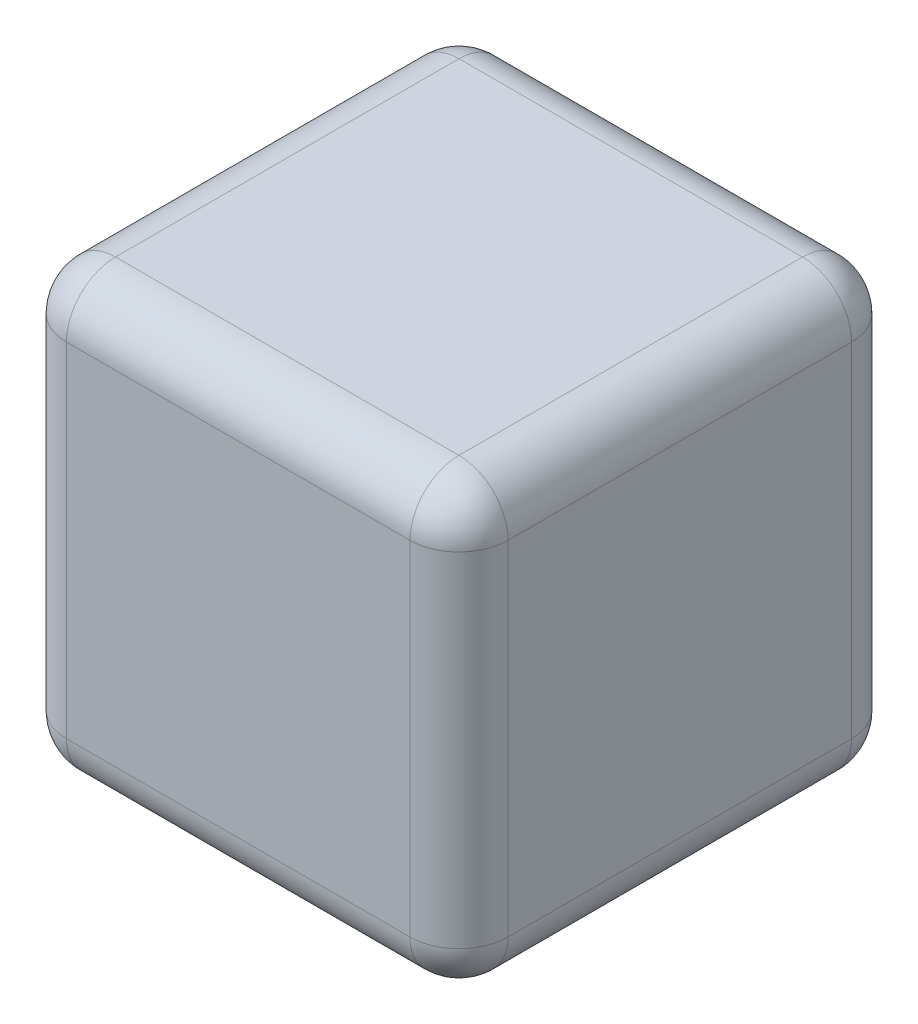
ISO-10303-21;
HEADER;
FILE_DESCRIPTION(('STEP AP214'),'2;1');
FILE_NAME('part.step','',(''),(''),'','','');
FILE_SCHEMA(('AUTOMOTIVE_DESIGN { 1 0 10303 214 1 1 1 1 }'));
ENDSEC;
DATA;
#1=APPLICATION_CONTEXT('core data for automotive mechanical design processes');
#2=APPLICATION_PROTOCOL_DEFINITION('international standard','automotive_design',2000,#1);
#3=PRODUCT_CONTEXT('',#1,'mechanical');
#4=PRODUCT('Part','Part','',(#3));
#5=PRODUCT_RELATED_PRODUCT_CATEGORY('part','',(#4));
#6=PRODUCT_DEFINITION_FORMATION('','',#4);
#7=PRODUCT_DEFINITION_CONTEXT('part definition',#1,'design');
#8=PRODUCT_DEFINITION('design','',#6,#7);
#9=PRODUCT_DEFINITION_SHAPE('','',#8);
#10=(LENGTH_UNIT() NAMED_UNIT(*) SI_UNIT(.MILLI.,.METRE.));
#11=(NAMED_UNIT(*) PLANE_ANGLE_UNIT() SI_UNIT($,.RADIAN.));
#12=(NAMED_UNIT(*) SI_UNIT($,.STERADIAN.) SOLID_ANGLE_UNIT());
#13=UNCERTAINTY_MEASURE_WITH_UNIT(LENGTH_MEASURE(1.E-05),#10,'distance_accuracy_value','');
#14=(GEOMETRIC_REPRESENTATION_CONTEXT(3) GLOBAL_UNCERTAINTY_ASSIGNED_CONTEXT((#13)) GLOBAL_UNIT_ASSIGNED_CONTEXT((#10,
#11,#12)) REPRESENTATION_CONTEXT('',''));
#15=CARTESIAN_POINT('',(0.,0.,0.));
#16=DIRECTION('',(0.,0.,1.));
#17=DIRECTION('',(1.,0.,0.));
#18=AXIS2_PLACEMENT_3D('',#15,#16,#17);
#19=CARTESIAN_POINT('',(4.5,4.5,-4.5));
#20=DIRECTION('',(0.,0.,1.));
#21=DIRECTION('',(0.,-1.,0.));
#22=AXIS2_PLACEMENT_3D('',#19,#20,#21);
#23=PLANE('',#22);
#24=DIRECTION('',(0.,1.,0.));
#25=VECTOR('',#24,1.);
#26=CARTESIAN_POINT('',(3.5,-4.5,-4.5));
#27=LINE('',#26,#25);
#28=CARTESIAN_POINT('',(3.5,3.5,-4.5));
#29=VERTEX_POINT('',#28);
#30=CARTESIAN_POINT('',(3.5,-3.5,-4.5));
#31=VERTEX_POINT('',#30);
#32=EDGE_CURVE('E176',#29,#31,#27,.F.);
#33=ORIENTED_EDGE('',*,*,#32,.T.);
#34=DIRECTION('',(-1.,0.,0.));
#35=VECTOR('',#34,1.);
#36=CARTESIAN_POINT('',(4.5,-3.5,-4.5));
#37=LINE('',#36,#35);
#38=CARTESIAN_POINT('',(-3.5,-3.5,-4.5));
#39=VERTEX_POINT('',#38);
#40=EDGE_CURVE('E181',#31,#39,#37,.T.);
#41=ORIENTED_EDGE('',*,*,#40,.T.);
#42=DIRECTION('',(0.,1.,0.));
#43=VECTOR('',#42,1.);
#44=CARTESIAN_POINT('',(-3.5,4.5,-4.5));
#45=LINE('',#44,#43);
#46=CARTESIAN_POINT('',(-3.5,3.5,-4.5));
#47=VERTEX_POINT('',#46);
#48=EDGE_CURVE('E178',#39,#47,#45,.T.);
#49=ORIENTED_EDGE('',*,*,#48,.T.);
#50=DIRECTION('',(-1.,0.,0.));
#51=VECTOR('',#50,1.);
#52=CARTESIAN_POINT('',(4.5,3.5,-4.5));
#53=LINE('',#52,#51);
#54=EDGE_CURVE('E174',#47,#29,#53,.F.);
#55=ORIENTED_EDGE('',*,*,#54,.T.);
#56=EDGE_LOOP('',(#33,#41,#49,#55));
#57=FACE_BOUND('',#56,.T.);
#58=ADVANCED_FACE('F33',(#57),#23,.F.);
#59=CARTESIAN_POINT('',(4.5,4.5,4.5));
#60=DIRECTION('',(0.,-1.,0.));
#61=DIRECTION('',(0.,0.,-1.));
#62=AXIS2_PLACEMENT_3D('',#59,#60,#61);
#63=PLANE('',#62);
#64=DIRECTION('',(-1.,0.,0.));
#65=VECTOR('',#64,1.);
#66=CARTESIAN_POINT('',(4.5,4.5,-3.5));
#67=LINE('',#66,#65);
#68=CARTESIAN_POINT('',(3.5,4.5,-3.5));
#69=VERTEX_POINT('',#68);
#70=CARTESIAN_POINT('',(-3.5,4.5,-3.5));
#71=VERTEX_POINT('',#70);
#72=EDGE_CURVE('E42',#69,#71,#67,.T.);
#73=ORIENTED_EDGE('',*,*,#72,.T.);
#74=DIRECTION('',(0.,0.,1.));
#75=VECTOR('',#74,1.);
#76=CARTESIAN_POINT('',(-3.5,4.5,4.5));
#77=LINE('',#76,#75);
#78=CARTESIAN_POINT('',(-3.5,4.5,3.5));
#79=VERTEX_POINT('',#78);
#80=EDGE_CURVE('E11',#71,#79,#77,.T.);
#81=ORIENTED_EDGE('',*,*,#80,.T.);
#82=DIRECTION('',(-1.,0.,0.));
#83=VECTOR('',#82,1.);
#84=CARTESIAN_POINT('',(4.5,4.5,3.5));
#85=LINE('',#84,#83);
#86=CARTESIAN_POINT('',(3.5,4.5,3.5));
#87=VERTEX_POINT('',#86);
#88=EDGE_CURVE('E199',#79,#87,#85,.F.);
#89=ORIENTED_EDGE('',*,*,#88,.T.);
#90=DIRECTION('',(0.,0.,1.));
#91=VECTOR('',#90,1.);
#92=CARTESIAN_POINT('',(3.5,4.5,-4.5));
#93=LINE('',#92,#91);
#94=EDGE_CURVE('E53',#87,#69,#93,.F.);
#95=ORIENTED_EDGE('',*,*,#94,.T.);
#96=EDGE_LOOP('',(#73,#81,#89,#95));
#97=FACE_BOUND('',#96,.T.);
#98=ADVANCED_FACE('F306',(#97),#63,.F.);
#99=CARTESIAN_POINT('',(4.5,4.5,4.5));
#100=DIRECTION('',(0.,0.,-1.));
#101=DIRECTION('',(-1.,0.,0.));
#102=AXIS2_PLACEMENT_3D('',#99,#100,#101);
#103=PLANE('',#102);
#104=DIRECTION('',(0.,-1.,0.));
#105=VECTOR('',#104,1.);
#106=CARTESIAN_POINT('',(-3.5,4.5,4.5));
#107=LINE('',#106,#105);
#108=CARTESIAN_POINT('',(-3.5,3.5,4.5));
#109=VERTEX_POINT('',#108);
#110=CARTESIAN_POINT('',(-3.5,-3.5,4.5));
#111=VERTEX_POINT('',#110);
#112=EDGE_CURVE('E133',#109,#111,#107,.T.);
#113=ORIENTED_EDGE('',*,*,#112,.T.);
#114=DIRECTION('',(-1.,0.,0.));
#115=VECTOR('',#114,1.);
#116=CARTESIAN_POINT('',(4.5,-3.5,4.5));
#117=LINE('',#116,#115);
#118=CARTESIAN_POINT('',(3.5,-3.5,4.5));
#119=VERTEX_POINT('',#118);
#120=EDGE_CURVE('E129',#111,#119,#117,.F.);
#121=ORIENTED_EDGE('',*,*,#120,.T.);
#122=DIRECTION('',(0.,-1.,0.));
#123=VECTOR('',#122,1.);
#124=CARTESIAN_POINT('',(3.5,4.5,4.5));
#125=LINE('',#124,#123);
#126=CARTESIAN_POINT('',(3.5,3.5,4.5));
#127=VERTEX_POINT('',#126);
#128=EDGE_CURVE('E121',#119,#127,#125,.F.);
#129=ORIENTED_EDGE('',*,*,#128,.T.);
#130=DIRECTION('',(-1.,0.,0.));
#131=VECTOR('',#130,1.);
#132=CARTESIAN_POINT('',(4.5,3.5,4.5));
#133=LINE('',#132,#131);
#134=EDGE_CURVE('E126',#127,#109,#133,.T.);
#135=ORIENTED_EDGE('',*,*,#134,.T.);
#136=EDGE_LOOP('',(#113,#121,#129,#135));
#137=FACE_BOUND('',#136,.T.);
#138=ADVANCED_FACE('F124',(#137),#103,.F.);
#139=CARTESIAN_POINT('',(4.5,-4.5,4.5));
#140=DIRECTION('',(0.,1.,0.));
#141=DIRECTION('',(0.,0.,1.));
#142=AXIS2_PLACEMENT_3D('',#139,#140,#141);
#143=PLANE('',#142);
#144=DIRECTION('',(0.,0.,-1.));
#145=VECTOR('',#144,1.);
#146=CARTESIAN_POINT('',(3.5,-4.5,4.5));
#147=LINE('',#146,#145);
#148=CARTESIAN_POINT('',(3.5,-4.5,-3.5));
#149=VERTEX_POINT('',#148);
#150=CARTESIAN_POINT('',(3.5,-4.5,3.5));
#151=VERTEX_POINT('',#150);
#152=EDGE_CURVE('E190',#149,#151,#147,.F.);
#153=ORIENTED_EDGE('',*,*,#152,.T.);
#154=DIRECTION('',(-1.,0.,0.));
#155=VECTOR('',#154,1.);
#156=CARTESIAN_POINT('',(4.5,-4.5,3.5));
#157=LINE('',#156,#155);
#158=CARTESIAN_POINT('',(-3.5,-4.5,3.5));
#159=VERTEX_POINT('',#158);
#160=EDGE_CURVE('E196',#151,#159,#157,.T.);
#161=ORIENTED_EDGE('',*,*,#160,.T.);
#162=DIRECTION('',(0.,0.,-1.));
#163=VECTOR('',#162,1.);
#164=CARTESIAN_POINT('',(-3.5,-4.5,4.5));
#165=LINE('',#164,#163);
#166=CARTESIAN_POINT('',(-3.5,-4.5,-3.5));
#167=VERTEX_POINT('',#166);
#168=EDGE_CURVE('E194',#159,#167,#165,.T.);
#169=ORIENTED_EDGE('',*,*,#168,.T.);
#170=DIRECTION('',(-1.,0.,0.));
#171=VECTOR('',#170,1.);
#172=CARTESIAN_POINT('',(4.5,-4.5,-3.5));
#173=LINE('',#172,#171);
#174=EDGE_CURVE('E192',#167,#149,#173,.F.);
#175=ORIENTED_EDGE('',*,*,#174,.T.);
#176=EDGE_LOOP('',(#153,#161,#169,#175));
#177=FACE_BOUND('',#176,.T.);
#178=ADVANCED_FACE('F265',(#177),#143,.F.);
#179=CARTESIAN_POINT('',(4.5,0.,0.));
#180=DIRECTION('',(1.,0.,0.));
#181=DIRECTION('',(0.,0.,-1.));
#182=AXIS2_PLACEMENT_3D('',#179,#180,#181);
#183=PLANE('',#182);
#184=DIRECTION('',(0.,-1.,0.));
#185=VECTOR('',#184,1.);
#186=CARTESIAN_POINT('',(4.5,-4.5,3.5));
#187=LINE('',#186,#185);
#188=CARTESIAN_POINT('',(4.5,3.5,3.5));
#189=VERTEX_POINT('',#188);
#190=CARTESIAN_POINT('',(4.5,-3.5,3.5));
#191=VERTEX_POINT('',#190);
#192=EDGE_CURVE('E141',#189,#191,#187,.T.);
#193=ORIENTED_EDGE('',*,*,#192,.T.);
#194=DIRECTION('',(0.,0.,-1.));
#195=VECTOR('',#194,1.);
#196=CARTESIAN_POINT('',(4.5,-3.5,-4.5));
#197=LINE('',#196,#195);
#198=CARTESIAN_POINT('',(4.5,-3.5,-3.5));
#199=VERTEX_POINT('',#198);
#200=EDGE_CURVE('E188',#191,#199,#197,.T.);
#201=ORIENTED_EDGE('',*,*,#200,.T.);
#202=DIRECTION('',(0.,1.,0.));
#203=VECTOR('',#202,1.);
#204=CARTESIAN_POINT('',(4.5,4.5,-3.5));
#205=LINE('',#204,#203);
#206=CARTESIAN_POINT('',(4.5,3.5,-3.5));
#207=VERTEX_POINT('',#206);
#208=EDGE_CURVE('E185',#199,#207,#205,.T.);
#209=ORIENTED_EDGE('',*,*,#208,.T.);
#210=DIRECTION('',(0.,0.,1.));
#211=VECTOR('',#210,1.);
#212=CARTESIAN_POINT('',(4.5,3.5,4.5));
#213=LINE('',#212,#211);
#214=EDGE_CURVE('E183',#207,#189,#213,.T.);
#215=ORIENTED_EDGE('',*,*,#214,.T.);
#216=EDGE_LOOP('',(#193,#201,#209,#215));
#217=FACE_BOUND('',#216,.T.);
#218=ADVANCED_FACE('F294',(#217),#183,.T.);
#219=CARTESIAN_POINT('',(-4.5,0.,0.));
#220=DIRECTION('',(1.,0.,0.));
#221=DIRECTION('',(0.,0.,-1.));
#222=AXIS2_PLACEMENT_3D('',#219,#220,#221);
#223=PLANE('',#222);
#224=DIRECTION('',(0.,1.,0.));
#225=VECTOR('',#224,1.);
#226=CARTESIAN_POINT('',(-4.5,0.,-3.5));
#227=LINE('',#226,#225);
#228=CARTESIAN_POINT('',(-4.5,3.5,-3.5));
#229=VERTEX_POINT('',#228);
#230=CARTESIAN_POINT('',(-4.5,-3.5,-3.5));
#231=VERTEX_POINT('',#230);
#232=EDGE_CURVE('E167',#229,#231,#227,.F.);
#233=ORIENTED_EDGE('',*,*,#232,.T.);
#234=DIRECTION('',(0.,0.,-1.));
#235=VECTOR('',#234,1.);
#236=CARTESIAN_POINT('',(-4.5,-3.5,0.));
#237=LINE('',#236,#235);
#238=CARTESIAN_POINT('',(-4.5,-3.5,3.5));
#239=VERTEX_POINT('',#238);
#240=EDGE_CURVE('E172',#231,#239,#237,.F.);
#241=ORIENTED_EDGE('',*,*,#240,.T.);
#242=DIRECTION('',(0.,-1.,0.));
#243=VECTOR('',#242,1.);
#244=CARTESIAN_POINT('',(-4.5,0.,3.5));
#245=LINE('',#244,#243);
#246=CARTESIAN_POINT('',(-4.5,3.5,3.5));
#247=VERTEX_POINT('',#246);
#248=EDGE_CURVE('E169',#239,#247,#245,.F.);
#249=ORIENTED_EDGE('',*,*,#248,.T.);
#250=DIRECTION('',(0.,0.,1.));
#251=VECTOR('',#250,1.);
#252=CARTESIAN_POINT('',(-4.5,3.5,0.));
#253=LINE('',#252,#251);
#254=EDGE_CURVE('E165',#247,#229,#253,.F.);
#255=ORIENTED_EDGE('',*,*,#254,.T.);
#256=EDGE_LOOP('',(#233,#241,#249,#255));
#257=FACE_BOUND('',#256,.T.);
#258=ADVANCED_FACE('F296',(#257),#223,.F.);
#259=CARTESIAN_POINT('',(3.5,0.,-3.5));
#260=DIRECTION('',(0.,-1.,0.));
#261=DIRECTION('',(0.,0.,-1.));
#262=AXIS2_PLACEMENT_3D('',#259,#260,#261);
#263=CYLINDRICAL_SURFACE('',#262,1.);
#264=CARTESIAN_POINT('',(3.5,3.5,-3.5));
#265=DIRECTION('',(0.,1.,0.));
#266=DIRECTION('',(0.,0.,1.));
#267=AXIS2_PLACEMENT_3D('',#264,#265,#266);
#268=CIRCLE('',#267,1.);
#269=EDGE_CURVE('E37',#207,#29,#268,.T.);
#270=ORIENTED_EDGE('',*,*,#269,.F.);
#271=ORIENTED_EDGE('',*,*,#208,.F.);
#272=CARTESIAN_POINT('',(3.5,-3.5,-3.5));
#273=DIRECTION('',(0.,-1.,0.));
#274=DIRECTION('',(1.,0.,0.));
#275=AXIS2_PLACEMENT_3D('',#272,#273,#274);
#276=CIRCLE('',#275,1.);
#277=EDGE_CURVE('E161',#31,#199,#276,.T.);
#278=ORIENTED_EDGE('',*,*,#277,.F.);
#279=ORIENTED_EDGE('',*,*,#32,.F.);
#280=EDGE_LOOP('',(#270,#271,#278,#279));
#281=FACE_BOUND('',#280,.T.);
#282=ADVANCED_FACE('F35',(#281),#263,.T.);
#283=CARTESIAN_POINT('',(3.5,3.5,-3.5));
#284=DIRECTION('',(0.,0.,-1.));
#285=DIRECTION('',(-1.,0.,0.));
#286=AXIS2_PLACEMENT_3D('',#283,#284,#285);
#287=SPHERICAL_SURFACE('',#286,1.);
#288=CARTESIAN_POINT('',(3.5,3.5,-3.5));
#289=DIRECTION('',(0.,0.,-1.));
#290=DIRECTION('',(-1.,0.,0.));
#291=AXIS2_PLACEMENT_3D('',#288,#289,#290);
#292=CIRCLE('',#291,1.);
#293=EDGE_CURVE('E244',#207,#69,#292,.F.);
#294=ORIENTED_EDGE('',*,*,#293,.F.);
#295=ORIENTED_EDGE('',*,*,#269,.T.);
#296=CARTESIAN_POINT('',(3.5,3.5,-3.5));
#297=DIRECTION('',(1.,0.,0.));
#298=DIRECTION('',(0.,0.,-1.));
#299=AXIS2_PLACEMENT_3D('',#296,#297,#298);
#300=CIRCLE('',#299,1.);
#301=EDGE_CURVE('E246',#69,#29,#300,.F.);
#302=ORIENTED_EDGE('',*,*,#301,.F.);
#303=EDGE_LOOP('',(#294,#295,#302));
#304=FACE_BOUND('',#303,.T.);
#305=ADVANCED_FACE('F289',(#304),#287,.T.);
#306=CARTESIAN_POINT('',(3.5,-3.5,-3.5));
#307=DIRECTION('',(1.,0.,0.));
#308=DIRECTION('',(0.,0.,-1.));
#309=AXIS2_PLACEMENT_3D('',#306,#307,#308);
#310=SPHERICAL_SURFACE('',#309,1.);
#311=CARTESIAN_POINT('',(3.5,-3.5,-3.5));
#312=DIRECTION('',(1.,0.,0.));
#313=DIRECTION('',(0.,0.,-1.));
#314=AXIS2_PLACEMENT_3D('',#311,#312,#313);
#315=CIRCLE('',#314,1.);
#316=EDGE_CURVE('E238',#31,#149,#315,.F.);
#317=ORIENTED_EDGE('',*,*,#316,.F.);
#318=ORIENTED_EDGE('',*,*,#277,.T.);
#319=CARTESIAN_POINT('',(3.5,-3.5,-3.5));
#320=DIRECTION('',(0.,0.,-1.));
#321=DIRECTION('',(-1.,0.,0.));
#322=AXIS2_PLACEMENT_3D('',#319,#320,#321);
#323=CIRCLE('',#322,1.);
#324=EDGE_CURVE('E241',#149,#199,#323,.F.);
#325=ORIENTED_EDGE('',*,*,#324,.F.);
#326=EDGE_LOOP('',(#317,#318,#325));
#327=FACE_BOUND('',#326,.T.);
#328=ADVANCED_FACE('F253',(#327),#310,.T.);
#329=CARTESIAN_POINT('',(4.5,3.5,-3.5));
#330=DIRECTION('',(-1.,0.,0.));
#331=DIRECTION('',(0.,0.,1.));
#332=AXIS2_PLACEMENT_3D('',#329,#330,#331);
#333=CYLINDRICAL_SURFACE('',#332,1.);
#334=ORIENTED_EDGE('',*,*,#301,.T.);
#335=ORIENTED_EDGE('',*,*,#54,.F.);
#336=CARTESIAN_POINT('',(-3.5,3.5,-3.5));
#337=DIRECTION('',(-1.,0.,0.));
#338=DIRECTION('',(0.,0.,1.));
#339=AXIS2_PLACEMENT_3D('',#336,#337,#338);
#340=CIRCLE('',#339,1.);
#341=EDGE_CURVE('E233',#71,#47,#340,.T.);
#342=ORIENTED_EDGE('',*,*,#341,.F.);
#343=ORIENTED_EDGE('',*,*,#72,.F.);
#344=EDGE_LOOP('',(#334,#335,#342,#343));
#345=FACE_BOUND('',#344,.T.);
#346=ADVANCED_FACE('F284',(#345),#333,.T.);
#347=CARTESIAN_POINT('',(3.5,3.5,0.));
#348=DIRECTION('',(0.,0.,-1.));
#349=DIRECTION('',(-1.,0.,0.));
#350=AXIS2_PLACEMENT_3D('',#347,#348,#349);
#351=CYLINDRICAL_SURFACE('',#350,1.);
#352=ORIENTED_EDGE('',*,*,#293,.T.);
#353=ORIENTED_EDGE('',*,*,#94,.F.);
#354=CARTESIAN_POINT('',(3.5,3.5,3.5));
#355=DIRECTION('',(0.,0.,1.));
#356=DIRECTION('',(1.,0.,0.));
#357=AXIS2_PLACEMENT_3D('',#354,#355,#356);
#358=CIRCLE('',#357,1.);
#359=EDGE_CURVE('E145',#189,#87,#358,.T.);
#360=ORIENTED_EDGE('',*,*,#359,.F.);
#361=ORIENTED_EDGE('',*,*,#214,.F.);
#362=EDGE_LOOP('',(#352,#353,#360,#361));
#363=FACE_BOUND('',#362,.T.);
#364=ADVANCED_FACE('F292',(#363),#351,.T.);
#365=CARTESIAN_POINT('',(3.5,0.,3.5));
#366=DIRECTION('',(0.,1.,0.));
#367=DIRECTION('',(0.,0.,1.));
#368=AXIS2_PLACEMENT_3D('',#365,#366,#367);
#369=CYLINDRICAL_SURFACE('',#368,1.);
#370=CARTESIAN_POINT('',(3.5,-3.5,3.5));
#371=DIRECTION('',(0.,-1.,0.));
#372=DIRECTION('',(0.,0.,-1.));
#373=AXIS2_PLACEMENT_3D('',#370,#371,#372);
#374=CIRCLE('',#373,1.);
#375=EDGE_CURVE('E146',#191,#119,#374,.T.);
#376=ORIENTED_EDGE('',*,*,#375,.F.);
#377=ORIENTED_EDGE('',*,*,#192,.F.);
#378=CARTESIAN_POINT('',(3.5,3.5,3.5));
#379=DIRECTION('',(0.,1.,0.));
#380=DIRECTION('',(0.,0.,1.));
#381=AXIS2_PLACEMENT_3D('',#378,#379,#380);
#382=CIRCLE('',#381,1.);
#383=EDGE_CURVE('E137',#127,#189,#382,.T.);
#384=ORIENTED_EDGE('',*,*,#383,.F.);
#385=ORIENTED_EDGE('',*,*,#128,.F.);
#386=EDGE_LOOP('',(#376,#377,#384,#385));
#387=FACE_BOUND('',#386,.T.);
#388=ADVANCED_FACE('F139',(#387),#369,.T.);
#389=CARTESIAN_POINT('',(3.5,-3.5,0.));
#390=DIRECTION('',(0.,0.,1.));
#391=DIRECTION('',(1.,0.,0.));
#392=AXIS2_PLACEMENT_3D('',#389,#390,#391);
#393=CYLINDRICAL_SURFACE('',#392,1.);
#394=ORIENTED_EDGE('',*,*,#324,.T.);
#395=ORIENTED_EDGE('',*,*,#200,.F.);
#396=CARTESIAN_POINT('',(3.5,-3.5,3.5));
#397=DIRECTION('',(0.,0.,1.));
#398=DIRECTION('',(1.,0.,0.));
#399=AXIS2_PLACEMENT_3D('',#396,#397,#398);
#400=CIRCLE('',#399,1.);
#401=EDGE_CURVE('E229',#151,#191,#400,.T.);
#402=ORIENTED_EDGE('',*,*,#401,.F.);
#403=ORIENTED_EDGE('',*,*,#152,.F.);
#404=EDGE_LOOP('',(#394,#395,#402,#403));
#405=FACE_BOUND('',#404,.T.);
#406=ADVANCED_FACE('F261',(#405),#393,.T.);
#407=CARTESIAN_POINT('',(4.5,-3.5,-3.5));
#408=DIRECTION('',(-1.,0.,0.));
#409=DIRECTION('',(0.,0.,1.));
#410=AXIS2_PLACEMENT_3D('',#407,#408,#409);
#411=CYLINDRICAL_SURFACE('',#410,1.);
#412=ORIENTED_EDGE('',*,*,#316,.T.);
#413=ORIENTED_EDGE('',*,*,#174,.F.);
#414=CARTESIAN_POINT('',(-3.5,-3.5,-3.5));
#415=DIRECTION('',(-1.,0.,0.));
#416=DIRECTION('',(0.,0.,1.));
#417=AXIS2_PLACEMENT_3D('',#414,#415,#416);
#418=CIRCLE('',#417,1.);
#419=EDGE_CURVE('E226',#39,#167,#418,.T.);
#420=ORIENTED_EDGE('',*,*,#419,.F.);
#421=ORIENTED_EDGE('',*,*,#40,.F.);
#422=EDGE_LOOP('',(#412,#413,#420,#421));
#423=FACE_BOUND('',#422,.T.);
#424=ADVANCED_FACE('F271',(#423),#411,.T.);
#425=CARTESIAN_POINT('',(-3.5,4.5,-3.5));
#426=DIRECTION('',(0.,1.,0.));
#427=DIRECTION('',(0.,0.,1.));
#428=AXIS2_PLACEMENT_3D('',#425,#426,#427);
#429=CYLINDRICAL_SURFACE('',#428,1.);
#430=CARTESIAN_POINT('',(-3.5,3.5,-3.5));
#431=DIRECTION('',(0.,1.,0.));
#432=DIRECTION('',(0.,0.,1.));
#433=AXIS2_PLACEMENT_3D('',#430,#431,#432);
#434=CIRCLE('',#433,1.);
#435=EDGE_CURVE('E235',#47,#229,#434,.T.);
#436=ORIENTED_EDGE('',*,*,#435,.F.);
#437=ORIENTED_EDGE('',*,*,#48,.F.);
#438=CARTESIAN_POINT('',(-3.5,-3.5,-3.5));
#439=DIRECTION('',(0.,-1.,0.));
#440=DIRECTION('',(0.,0.,-1.));
#441=AXIS2_PLACEMENT_3D('',#438,#439,#440);
#442=CIRCLE('',#441,1.);
#443=EDGE_CURVE('E223',#231,#39,#442,.T.);
#444=ORIENTED_EDGE('',*,*,#443,.F.);
#445=ORIENTED_EDGE('',*,*,#232,.F.);
#446=EDGE_LOOP('',(#436,#437,#444,#445));
#447=FACE_BOUND('',#446,.T.);
#448=ADVANCED_FACE('F277',(#447),#429,.T.);
#449=CARTESIAN_POINT('',(-3.5,3.5,-3.5));
#450=DIRECTION('',(0.,0.,-1.));
#451=DIRECTION('',(-1.,0.,0.));
#452=AXIS2_PLACEMENT_3D('',#449,#450,#451);
#453=SPHERICAL_SURFACE('',#452,1.);
#454=ORIENTED_EDGE('',*,*,#341,.T.);
#455=ORIENTED_EDGE('',*,*,#435,.T.);
#456=CARTESIAN_POINT('',(-3.5,3.5,-3.5));
#457=DIRECTION('',(0.,0.,-1.));
#458=DIRECTION('',(0.,1.,0.));
#459=AXIS2_PLACEMENT_3D('',#456,#457,#458);
#460=CIRCLE('',#459,1.);
#461=EDGE_CURVE('E153',#71,#229,#460,.F.);
#462=ORIENTED_EDGE('',*,*,#461,.F.);
#463=EDGE_LOOP('',(#454,#455,#462));
#464=FACE_BOUND('',#463,.T.);
#465=ADVANCED_FACE('F350',(#464),#453,.T.);
#466=CARTESIAN_POINT('',(3.5,3.5,3.5));
#467=DIRECTION('',(1.,0.,0.));
#468=DIRECTION('',(0.,0.,-1.));
#469=AXIS2_PLACEMENT_3D('',#466,#467,#468);
#470=SPHERICAL_SURFACE('',#469,1.);
#471=ORIENTED_EDGE('',*,*,#383,.T.);
#472=ORIENTED_EDGE('',*,*,#359,.T.);
#473=CARTESIAN_POINT('',(3.5,3.5,3.5));
#474=DIRECTION('',(1.,0.,0.));
#475=DIRECTION('',(0.,0.,-1.));
#476=AXIS2_PLACEMENT_3D('',#473,#474,#475);
#477=CIRCLE('',#476,1.);
#478=EDGE_CURVE('E149',#127,#87,#477,.F.);
#479=ORIENTED_EDGE('',*,*,#478,.F.);
#480=EDGE_LOOP('',(#471,#472,#479));
#481=FACE_BOUND('',#480,.T.);
#482=ADVANCED_FACE('F150',(#481),#470,.T.);
#483=CARTESIAN_POINT('',(3.5,-3.5,3.5));
#484=DIRECTION('',(1.,0.,0.));
#485=DIRECTION('',(0.,0.,-1.));
#486=AXIS2_PLACEMENT_3D('',#483,#484,#485);
#487=SPHERICAL_SURFACE('',#486,1.);
#488=ORIENTED_EDGE('',*,*,#401,.T.);
#489=ORIENTED_EDGE('',*,*,#375,.T.);
#490=CARTESIAN_POINT('',(3.5,-3.5,3.5));
#491=DIRECTION('',(1.,0.,0.));
#492=DIRECTION('',(0.,0.,-1.));
#493=AXIS2_PLACEMENT_3D('',#490,#491,#492);
#494=CIRCLE('',#493,1.);
#495=EDGE_CURVE('E154',#151,#119,#494,.F.);
#496=ORIENTED_EDGE('',*,*,#495,.F.);
#497=EDGE_LOOP('',(#488,#489,#496));
#498=FACE_BOUND('',#497,.T.);
#499=ADVANCED_FACE('F343',(#498),#487,.T.);
#500=CARTESIAN_POINT('',(-3.5,-3.5,-3.5));
#501=DIRECTION('',(0.,0.,-1.));
#502=DIRECTION('',(-1.,0.,0.));
#503=AXIS2_PLACEMENT_3D('',#500,#501,#502);
#504=SPHERICAL_SURFACE('',#503,1.);
#505=ORIENTED_EDGE('',*,*,#443,.T.);
#506=ORIENTED_EDGE('',*,*,#419,.T.);
#507=CARTESIAN_POINT('',(-3.5,-3.5,-3.5));
#508=DIRECTION('',(0.,0.,-1.));
#509=DIRECTION('',(-1.,0.,0.));
#510=AXIS2_PLACEMENT_3D('',#507,#508,#509);
#511=CIRCLE('',#510,1.);
#512=EDGE_CURVE('E216',#231,#167,#511,.F.);
#513=ORIENTED_EDGE('',*,*,#512,.F.);
#514=EDGE_LOOP('',(#505,#506,#513));
#515=FACE_BOUND('',#514,.T.);
#516=ADVANCED_FACE('F339',(#515),#504,.T.);
#517=CARTESIAN_POINT('',(-3.5,3.5,4.5));
#518=DIRECTION('',(0.,0.,1.));
#519=DIRECTION('',(1.,0.,0.));
#520=AXIS2_PLACEMENT_3D('',#517,#518,#519);
#521=CYLINDRICAL_SURFACE('',#520,1.);
#522=ORIENTED_EDGE('',*,*,#461,.T.);
#523=ORIENTED_EDGE('',*,*,#254,.F.);
#524=CARTESIAN_POINT('',(-3.5,3.5,3.5));
#525=DIRECTION('',(0.,0.,1.));
#526=DIRECTION('',(1.,0.,0.));
#527=AXIS2_PLACEMENT_3D('',#524,#525,#526);
#528=CIRCLE('',#527,1.);
#529=EDGE_CURVE('E213',#79,#247,#528,.T.);
#530=ORIENTED_EDGE('',*,*,#529,.F.);
#531=ORIENTED_EDGE('',*,*,#80,.F.);
#532=EDGE_LOOP('',(#522,#523,#530,#531));
#533=FACE_BOUND('',#532,.T.);
#534=ADVANCED_FACE('F336',(#533),#521,.T.);
#535=CARTESIAN_POINT('',(4.5,3.5,3.5));
#536=DIRECTION('',(-1.,0.,0.));
#537=DIRECTION('',(0.,0.,1.));
#538=AXIS2_PLACEMENT_3D('',#535,#536,#537);
#539=CYLINDRICAL_SURFACE('',#538,1.);
#540=ORIENTED_EDGE('',*,*,#478,.T.);
#541=ORIENTED_EDGE('',*,*,#88,.F.);
#542=CARTESIAN_POINT('',(-3.5,3.5,3.5));
#543=DIRECTION('',(-1.,0.,0.));
#544=DIRECTION('',(0.,0.,1.));
#545=AXIS2_PLACEMENT_3D('',#542,#543,#544);
#546=CIRCLE('',#545,1.);
#547=EDGE_CURVE('E157',#109,#79,#546,.T.);
#548=ORIENTED_EDGE('',*,*,#547,.F.);
#549=ORIENTED_EDGE('',*,*,#134,.F.);
#550=EDGE_LOOP('',(#540,#541,#548,#549));
#551=FACE_BOUND('',#550,.T.);
#552=ADVANCED_FACE('F156',(#551),#539,.T.);
#553=CARTESIAN_POINT('',(4.5,-3.5,3.5));
#554=DIRECTION('',(-1.,0.,0.));
#555=DIRECTION('',(0.,0.,1.));
#556=AXIS2_PLACEMENT_3D('',#553,#554,#555);
#557=CYLINDRICAL_SURFACE('',#556,1.);
#558=ORIENTED_EDGE('',*,*,#495,.T.);
#559=ORIENTED_EDGE('',*,*,#120,.F.);
#560=CARTESIAN_POINT('',(-3.5,-3.5,3.5));
#561=DIRECTION('',(-1.,0.,0.));
#562=DIRECTION('',(0.,0.,1.));
#563=AXIS2_PLACEMENT_3D('',#560,#561,#562);
#564=CIRCLE('',#563,1.);
#565=EDGE_CURVE('E209',#159,#111,#564,.T.);
#566=ORIENTED_EDGE('',*,*,#565,.F.);
#567=ORIENTED_EDGE('',*,*,#160,.F.);
#568=EDGE_LOOP('',(#558,#559,#566,#567));
#569=FACE_BOUND('',#568,.T.);
#570=ADVANCED_FACE('F329',(#569),#557,.T.);
#571=CARTESIAN_POINT('',(-3.5,-3.5,4.5));
#572=DIRECTION('',(0.,0.,-1.));
#573=DIRECTION('',(-1.,0.,0.));
#574=AXIS2_PLACEMENT_3D('',#571,#572,#573);
#575=CYLINDRICAL_SURFACE('',#574,1.);
#576=ORIENTED_EDGE('',*,*,#512,.T.);
#577=ORIENTED_EDGE('',*,*,#168,.F.);
#578=CARTESIAN_POINT('',(-3.5,-3.5,3.5));
#579=DIRECTION('',(0.,0.,1.));
#580=DIRECTION('',(1.,0.,0.));
#581=AXIS2_PLACEMENT_3D('',#578,#579,#580);
#582=CIRCLE('',#581,1.);
#583=EDGE_CURVE('E207',#239,#159,#582,.T.);
#584=ORIENTED_EDGE('',*,*,#583,.F.);
#585=ORIENTED_EDGE('',*,*,#240,.F.);
#586=EDGE_LOOP('',(#576,#577,#584,#585));
#587=FACE_BOUND('',#586,.T.);
#588=ADVANCED_FACE('F325',(#587),#575,.T.);
#589=CARTESIAN_POINT('',(-3.5,3.5,3.5));
#590=DIRECTION('',(0.,1.,0.));
#591=DIRECTION('',(-1.,0.,0.));
#592=AXIS2_PLACEMENT_3D('',#589,#590,#591);
#593=SPHERICAL_SURFACE('',#592,1.);
#594=ORIENTED_EDGE('',*,*,#547,.T.);
#595=ORIENTED_EDGE('',*,*,#529,.T.);
#596=CARTESIAN_POINT('',(-3.5,3.5,3.5));
#597=DIRECTION('',(0.,1.,0.));
#598=DIRECTION('',(0.,0.,1.));
#599=AXIS2_PLACEMENT_3D('',#596,#597,#598);
#600=CIRCLE('',#599,1.);
#601=EDGE_CURVE('E205',#109,#247,#600,.F.);
#602=ORIENTED_EDGE('',*,*,#601,.F.);
#603=EDGE_LOOP('',(#594,#595,#602));
#604=FACE_BOUND('',#603,.T.);
#605=ADVANCED_FACE('F321',(#604),#593,.T.);
#606=CARTESIAN_POINT('',(-3.5,-3.5,3.5));
#607=DIRECTION('',(0.,-1.,0.));
#608=DIRECTION('',(1.,0.,0.));
#609=AXIS2_PLACEMENT_3D('',#606,#607,#608);
#610=SPHERICAL_SURFACE('',#609,1.);
#611=ORIENTED_EDGE('',*,*,#583,.T.);
#612=ORIENTED_EDGE('',*,*,#565,.T.);
#613=CARTESIAN_POINT('',(-3.5,-3.5,3.5));
#614=DIRECTION('',(0.,-1.,0.));
#615=DIRECTION('',(0.,0.,-1.));
#616=AXIS2_PLACEMENT_3D('',#613,#614,#615);
#617=CIRCLE('',#616,1.);
#618=EDGE_CURVE('E203',#239,#111,#617,.F.);
#619=ORIENTED_EDGE('',*,*,#618,.F.);
#620=EDGE_LOOP('',(#611,#612,#619));
#621=FACE_BOUND('',#620,.T.);
#622=ADVANCED_FACE('F317',(#621),#610,.T.);
#623=CARTESIAN_POINT('',(-3.5,4.5,3.5));
#624=DIRECTION('',(0.,-1.,0.));
#625=DIRECTION('',(0.,0.,-1.));
#626=AXIS2_PLACEMENT_3D('',#623,#624,#625);
#627=CYLINDRICAL_SURFACE('',#626,1.);
#628=ORIENTED_EDGE('',*,*,#601,.T.);
#629=ORIENTED_EDGE('',*,*,#248,.F.);
#630=ORIENTED_EDGE('',*,*,#618,.T.);
#631=ORIENTED_EDGE('',*,*,#112,.F.);
#632=EDGE_LOOP('',(#628,#629,#630,#631));
#633=FACE_BOUND('',#632,.T.);
#634=ADVANCED_FACE('F314',(#633),#627,.T.);
#635=CLOSED_SHELL('',(#58,#98,#138,#178,#218,#258,#282,#305,#328,#346,#364,#388,#406,#424,#448,
#465,#482,#499,#516,#534,#552,#570,#588,#605,#622,#634));
#636=MANIFOLD_SOLID_BREP('B2',#635);
#637=ADVANCED_BREP_SHAPE_REPRESENTATION('',(#18,#636),#14);
#638=SHAPE_DEFINITION_REPRESENTATION(#9,#637);
ENDSEC;
END-ISO-10303-21;
